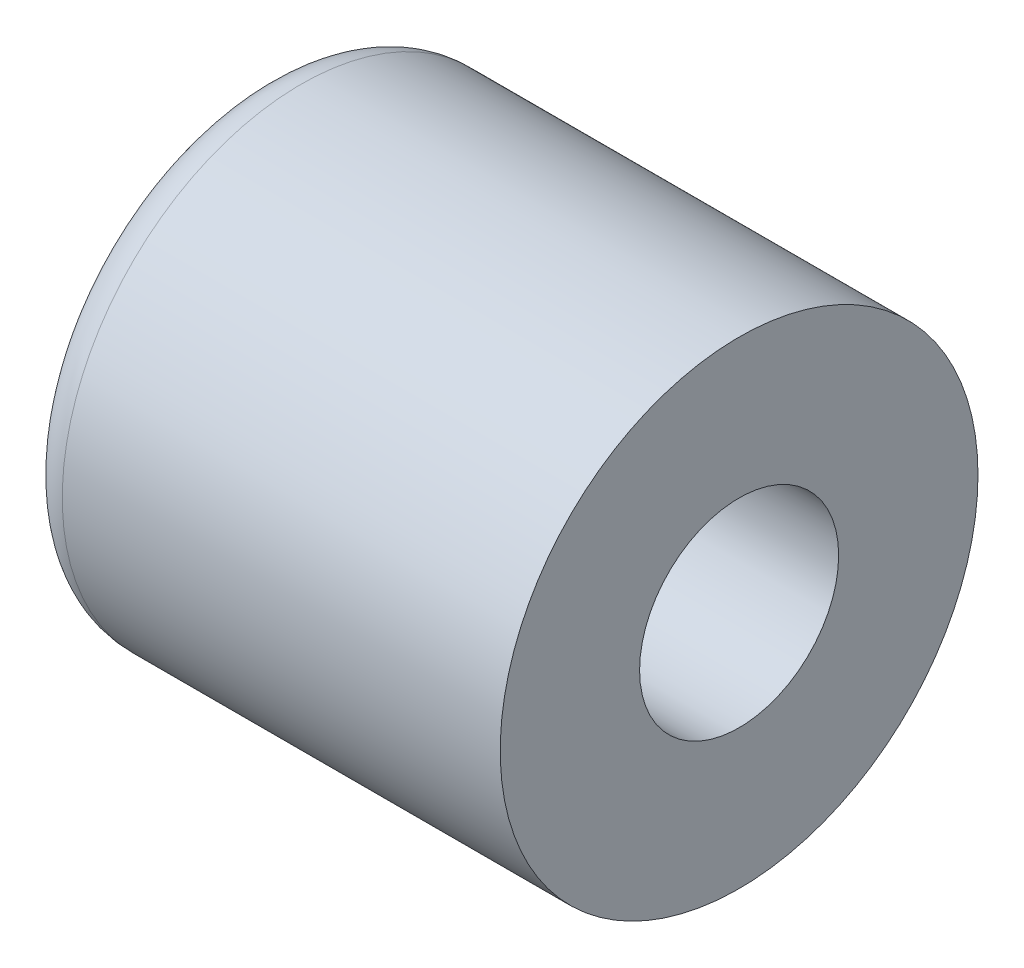
ISO-10303-21;
HEADER;
FILE_DESCRIPTION(('STEP AP214'),'2;1');
FILE_NAME('part.step','',(''),(''),'','','');
FILE_SCHEMA(('AUTOMOTIVE_DESIGN { 1 0 10303 214 1 1 1 1 }'));
ENDSEC;
DATA;
#1=APPLICATION_CONTEXT('core data for automotive mechanical design processes');
#2=APPLICATION_PROTOCOL_DEFINITION('international standard','automotive_design',2000,#1);
#3=PRODUCT_CONTEXT('',#1,'mechanical');
#4=PRODUCT('Part','Part','',(#3));
#5=PRODUCT_RELATED_PRODUCT_CATEGORY('part','',(#4));
#6=PRODUCT_DEFINITION_FORMATION('','',#4);
#7=PRODUCT_DEFINITION_CONTEXT('part definition',#1,'design');
#8=PRODUCT_DEFINITION('design','',#6,#7);
#9=PRODUCT_DEFINITION_SHAPE('','',#8);
#10=(LENGTH_UNIT() NAMED_UNIT(*) SI_UNIT(.MILLI.,.METRE.));
#11=(NAMED_UNIT(*) PLANE_ANGLE_UNIT() SI_UNIT($,.RADIAN.));
#12=(NAMED_UNIT(*) SI_UNIT($,.STERADIAN.) SOLID_ANGLE_UNIT());
#13=UNCERTAINTY_MEASURE_WITH_UNIT(LENGTH_MEASURE(1.E-05),#10,'distance_accuracy_value','');
#14=(GEOMETRIC_REPRESENTATION_CONTEXT(3) GLOBAL_UNCERTAINTY_ASSIGNED_CONTEXT((#13)) GLOBAL_UNIT_ASSIGNED_CONTEXT((#10,
#11,#12)) REPRESENTATION_CONTEXT('',''));
#15=CARTESIAN_POINT('',(0.,0.,0.));
#16=DIRECTION('',(0.,0.,1.));
#17=DIRECTION('',(1.,0.,0.));
#18=AXIS2_PLACEMENT_3D('',#15,#16,#17);
#19=CARTESIAN_POINT('',(1.,0.,0.));
#20=DIRECTION('',(1.,0.,0.));
#21=DIRECTION('',(0.,0.,-1.));
#22=AXIS2_PLACEMENT_3D('',#19,#20,#21);
#23=TOROIDAL_SURFACE('',#22,5.,1.);
#24=CARTESIAN_POINT('',(0.,0.,0.));
#25=DIRECTION('',(1.,0.,0.));
#26=DIRECTION('',(0.,0.,-1.));
#27=AXIS2_PLACEMENT_3D('',#24,#25,#26);
#28=CIRCLE('',#27,5.);
#29=CARTESIAN_POINT('',(0.,0.,-5.));
#30=VERTEX_POINT('',#29);
#31=EDGE_CURVE('E37',#30,#30,#28,.F.);
#32=ORIENTED_EDGE('',*,*,#31,.F.);
#33=EDGE_LOOP('',(#32));
#34=FACE_BOUND('',#33,.T.);
#35=CARTESIAN_POINT('',(1.,0.,0.));
#36=DIRECTION('',(1.,0.,0.));
#37=DIRECTION('',(0.,0.,-1.));
#38=AXIS2_PLACEMENT_3D('',#35,#36,#37);
#39=CIRCLE('',#38,6.);
#40=CARTESIAN_POINT('',(1.,0.,-6.));
#41=VERTEX_POINT('',#40);
#42=EDGE_CURVE('E10',#41,#41,#39,.T.);
#43=ORIENTED_EDGE('',*,*,#42,.F.);
#44=EDGE_LOOP('',(#43));
#45=FACE_BOUND('',#44,.T.);
#46=ADVANCED_FACE('F31',(#34,#45),#23,.T.);
#47=CARTESIAN_POINT('',(12.,0.,0.));
#48=DIRECTION('',(1.,0.,0.));
#49=DIRECTION('',(0.,0.,-1.));
#50=AXIS2_PLACEMENT_3D('',#47,#48,#49);
#51=PLANE('',#50);
#52=CARTESIAN_POINT('',(12.,0.,0.));
#53=DIRECTION('',(1.,0.,0.));
#54=DIRECTION('',(0.,0.,-1.));
#55=AXIS2_PLACEMENT_3D('',#52,#53,#54);
#56=CIRCLE('',#55,6.);
#57=CARTESIAN_POINT('',(12.,0.,-6.));
#58=VERTEX_POINT('',#57);
#59=EDGE_CURVE('E41',#58,#58,#56,.T.);
#60=ORIENTED_EDGE('',*,*,#59,.T.);
#61=EDGE_LOOP('',(#60));
#62=FACE_BOUND('',#61,.T.);
#63=CARTESIAN_POINT('',(12.,0.,0.));
#64=DIRECTION('',(1.,0.,0.));
#65=DIRECTION('',(0.,0.,-1.));
#66=AXIS2_PLACEMENT_3D('',#63,#64,#65);
#67=CIRCLE('',#66,2.5);
#68=CARTESIAN_POINT('',(12.,0.,-2.5));
#69=VERTEX_POINT('',#68);
#70=EDGE_CURVE('E45',#69,#69,#67,.T.);
#71=ORIENTED_EDGE('',*,*,#70,.F.);
#72=EDGE_LOOP('',(#71));
#73=FACE_BOUND('',#72,.T.);
#74=ADVANCED_FACE('F57',(#62,#73),#51,.T.);
#75=CARTESIAN_POINT('',(0.,0.,0.));
#76=DIRECTION('',(1.,0.,0.));
#77=DIRECTION('',(0.,0.,-1.));
#78=AXIS2_PLACEMENT_3D('',#75,#76,#77);
#79=PLANE('',#78);
#80=ORIENTED_EDGE('',*,*,#31,.T.);
#81=EDGE_LOOP('',(#80));
#82=FACE_BOUND('',#81,.T.);
#83=CARTESIAN_POINT('',(0.,0.,0.));
#84=DIRECTION('',(1.,0.,0.));
#85=DIRECTION('',(0.,0.,-1.));
#86=AXIS2_PLACEMENT_3D('',#83,#84,#85);
#87=CIRCLE('',#86,2.5);
#88=CARTESIAN_POINT('',(0.,0.,-2.5));
#89=VERTEX_POINT('',#88);
#90=EDGE_CURVE('E48',#89,#89,#87,.T.);
#91=ORIENTED_EDGE('',*,*,#90,.T.);
#92=EDGE_LOOP('',(#91));
#93=FACE_BOUND('',#92,.T.);
#94=ADVANCED_FACE('F59',(#82,#93),#79,.F.);
#95=CARTESIAN_POINT('',(12.,0.,0.));
#96=DIRECTION('',(-1.,0.,0.));
#97=DIRECTION('',(0.,0.,1.));
#98=AXIS2_PLACEMENT_3D('',#95,#96,#97);
#99=CYLINDRICAL_SURFACE('',#98,6.);
#100=ORIENTED_EDGE('',*,*,#42,.T.);
#101=EDGE_LOOP('',(#100));
#102=FACE_BOUND('',#101,.T.);
#103=ORIENTED_EDGE('',*,*,#59,.F.);
#104=EDGE_LOOP('',(#103));
#105=FACE_BOUND('',#104,.T.);
#106=ADVANCED_FACE('F66',(#102,#105),#99,.T.);
#107=CARTESIAN_POINT('',(12.,0.,0.));
#108=DIRECTION('',(-1.,0.,0.));
#109=DIRECTION('',(0.,0.,1.));
#110=AXIS2_PLACEMENT_3D('',#107,#108,#109);
#111=CYLINDRICAL_SURFACE('',#110,2.5);
#112=ORIENTED_EDGE('',*,*,#70,.T.);
#113=EDGE_LOOP('',(#112));
#114=FACE_BOUND('',#113,.T.);
#115=ORIENTED_EDGE('',*,*,#90,.F.);
#116=EDGE_LOOP('',(#115));
#117=FACE_BOUND('',#116,.T.);
#118=ADVANCED_FACE('F54',(#114,#117),#111,.F.);
#119=CLOSED_SHELL('',(#46,#74,#94,#106,#118));
#120=MANIFOLD_SOLID_BREP('B2',#119);
#121=ADVANCED_BREP_SHAPE_REPRESENTATION('',(#18,#120),#14);
#122=SHAPE_DEFINITION_REPRESENTATION(#9,#121);
ENDSEC;
END-ISO-10303-21;
